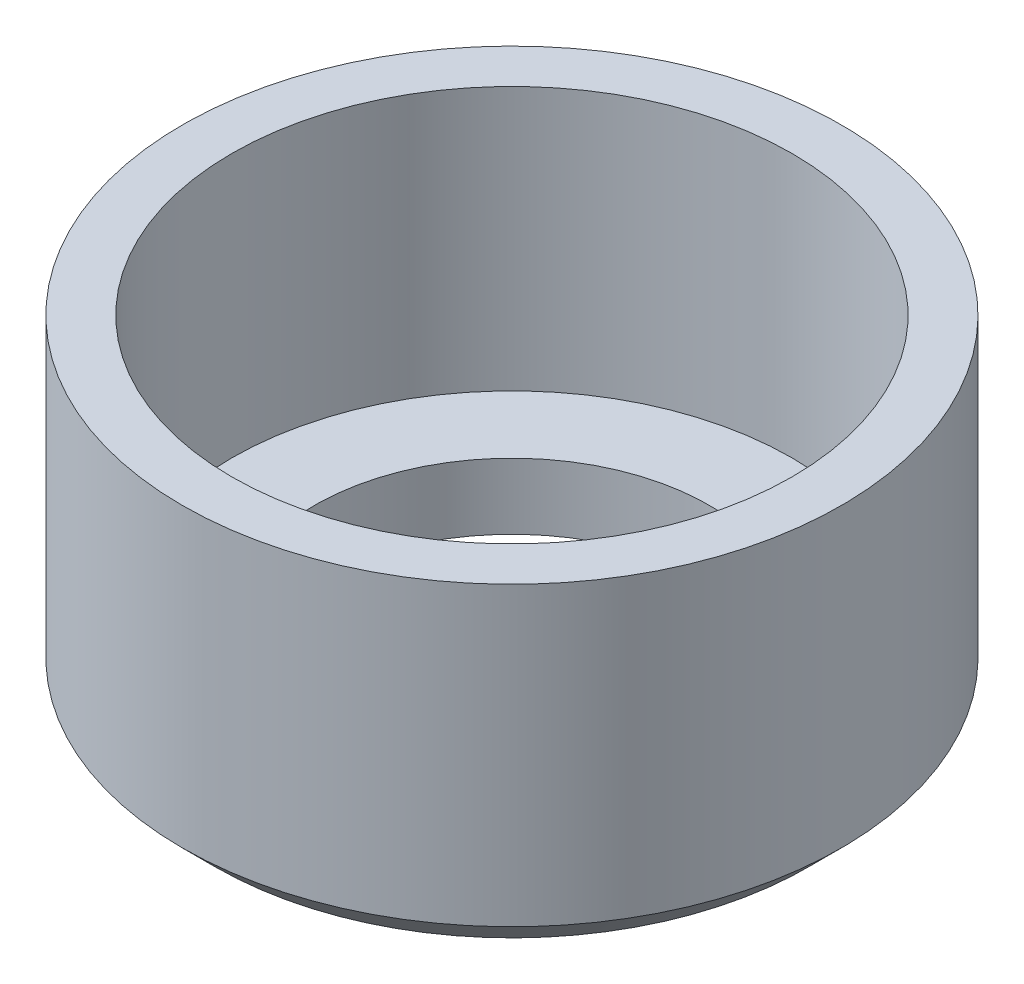
ISO-10303-21;
HEADER;
FILE_DESCRIPTION(('STEP AP214'),'2;1');
FILE_NAME('part.step','',(''),(''),'','','');
FILE_SCHEMA(('AUTOMOTIVE_DESIGN { 1 0 10303 214 1 1 1 1 }'));
ENDSEC;
DATA;
#1=APPLICATION_CONTEXT('core data for automotive mechanical design processes');
#2=APPLICATION_PROTOCOL_DEFINITION('international standard','automotive_design',2000,#1);
#3=PRODUCT_CONTEXT('',#1,'mechanical');
#4=PRODUCT('Part','Part','',(#3));
#5=PRODUCT_RELATED_PRODUCT_CATEGORY('part','',(#4));
#6=PRODUCT_DEFINITION_FORMATION('','',#4);
#7=PRODUCT_DEFINITION_CONTEXT('part definition',#1,'design');
#8=PRODUCT_DEFINITION('design','',#6,#7);
#9=PRODUCT_DEFINITION_SHAPE('','',#8);
#10=(LENGTH_UNIT() NAMED_UNIT(*) SI_UNIT(.MILLI.,.METRE.));
#11=(NAMED_UNIT(*) PLANE_ANGLE_UNIT() SI_UNIT($,.RADIAN.));
#12=(NAMED_UNIT(*) SI_UNIT($,.STERADIAN.) SOLID_ANGLE_UNIT());
#13=UNCERTAINTY_MEASURE_WITH_UNIT(LENGTH_MEASURE(1.E-05),#10,'distance_accuracy_value','');
#14=(GEOMETRIC_REPRESENTATION_CONTEXT(3) GLOBAL_UNCERTAINTY_ASSIGNED_CONTEXT((#13)) GLOBAL_UNIT_ASSIGNED_CONTEXT((#10,
#11,#12)) REPRESENTATION_CONTEXT('',''));
#15=CARTESIAN_POINT('',(0.,0.,0.));
#16=DIRECTION('',(0.,0.,1.));
#17=DIRECTION('',(1.,0.,0.));
#18=AXIS2_PLACEMENT_3D('',#15,#16,#17);
#19=CARTESIAN_POINT('',(0.,10.,0.));
#20=DIRECTION('',(0.,-1.,0.));
#21=DIRECTION('',(0.,0.,-1.));
#22=AXIS2_PLACEMENT_3D('',#19,#20,#21);
#23=CYLINDRICAL_SURFACE('',#22,6.);
#24=CARTESIAN_POINT('',(0.,0.,0.));
#25=DIRECTION('',(0.,1.,0.));
#26=DIRECTION('',(0.,0.,1.));
#27=AXIS2_PLACEMENT_3D('',#24,#25,#26);
#28=CIRCLE('',#27,6.);
#29=CARTESIAN_POINT('',(0.,0.,6.));
#30=VERTEX_POINT('',#29);
#31=EDGE_CURVE('E48',#30,#30,#28,.T.);
#32=ORIENTED_EDGE('',*,*,#31,.F.);
#33=EDGE_LOOP('',(#32));
#34=FACE_BOUND('',#33,.T.);
#35=CARTESIAN_POINT('',(0.,2.,0.));
#36=DIRECTION('',(0.,1.,0.));
#37=DIRECTION('',(0.,0.,1.));
#38=AXIS2_PLACEMENT_3D('',#35,#36,#37);
#39=CIRCLE('',#38,6.);
#40=CARTESIAN_POINT('',(0.,2.,6.));
#41=VERTEX_POINT('',#40);
#42=EDGE_CURVE('E51',#41,#41,#39,.T.);
#43=ORIENTED_EDGE('',*,*,#42,.T.);
#44=EDGE_LOOP('',(#43));
#45=FACE_BOUND('',#44,.T.);
#46=ADVANCED_FACE('F33',(#34,#45),#23,.F.);
#47=CARTESIAN_POINT('',(0.,10.,0.));
#48=DIRECTION('',(0.,1.,0.));
#49=DIRECTION('',(0.,0.,1.));
#50=AXIS2_PLACEMENT_3D('',#47,#48,#49);
#51=PLANE('',#50);
#52=CARTESIAN_POINT('',(0.,10.,0.));
#53=DIRECTION('',(0.,1.,0.));
#54=DIRECTION('',(0.,0.,1.));
#55=AXIS2_PLACEMENT_3D('',#52,#53,#54);
#56=CIRCLE('',#55,8.5);
#57=CARTESIAN_POINT('',(0.,10.,8.5));
#58=VERTEX_POINT('',#57);
#59=EDGE_CURVE('E57',#58,#58,#56,.T.);
#60=ORIENTED_EDGE('',*,*,#59,.F.);
#61=EDGE_LOOP('',(#60));
#62=FACE_BOUND('',#61,.T.);
#63=CARTESIAN_POINT('',(0.,10.,0.));
#64=DIRECTION('',(0.,1.,0.));
#65=DIRECTION('',(0.,0.,1.));
#66=AXIS2_PLACEMENT_3D('',#63,#64,#65);
#67=CIRCLE('',#66,10.);
#68=CARTESIAN_POINT('',(0.,10.,10.));
#69=VERTEX_POINT('',#68);
#70=EDGE_CURVE('E44',#69,#69,#67,.T.);
#71=ORIENTED_EDGE('',*,*,#70,.T.);
#72=EDGE_LOOP('',(#71));
#73=FACE_BOUND('',#72,.T.);
#74=ADVANCED_FACE('F72',(#62,#73),#51,.T.);
#75=CARTESIAN_POINT('',(0.,0.,0.));
#76=DIRECTION('',(0.,1.,0.));
#77=DIRECTION('',(0.,0.,1.));
#78=AXIS2_PLACEMENT_3D('',#75,#76,#77);
#79=PLANE('',#78);
#80=CARTESIAN_POINT('',(0.,0.,0.));
#81=DIRECTION('',(0.,1.,0.));
#82=DIRECTION('',(0.,0.,1.));
#83=AXIS2_PLACEMENT_3D('',#80,#81,#82);
#84=CIRCLE('',#83,9.);
#85=CARTESIAN_POINT('',(0.,0.,9.));
#86=VERTEX_POINT('',#85);
#87=EDGE_CURVE('E10',#86,#86,#84,.F.);
#88=ORIENTED_EDGE('',*,*,#87,.T.);
#89=EDGE_LOOP('',(#88));
#90=FACE_BOUND('',#89,.T.);
#91=ORIENTED_EDGE('',*,*,#31,.T.);
#92=EDGE_LOOP('',(#91));
#93=FACE_BOUND('',#92,.T.);
#94=ADVANCED_FACE('F75',(#90,#93),#79,.F.);
#95=CARTESIAN_POINT('',(0.,10.,0.));
#96=DIRECTION('',(0.,-1.,0.));
#97=DIRECTION('',(0.,0.,-1.));
#98=AXIS2_PLACEMENT_3D('',#95,#96,#97);
#99=CYLINDRICAL_SURFACE('',#98,10.);
#100=CARTESIAN_POINT('',(0.,0.999999999999997,0.));
#101=DIRECTION('',(0.,1.,0.));
#102=DIRECTION('',(0.,0.,1.));
#103=AXIS2_PLACEMENT_3D('',#100,#101,#102);
#104=CIRCLE('',#103,10.);
#105=CARTESIAN_POINT('',(0.,0.999999999999997,10.));
#106=VERTEX_POINT('',#105);
#107=EDGE_CURVE('E40',#106,#106,#104,.T.);
#108=ORIENTED_EDGE('',*,*,#107,.T.);
#109=EDGE_LOOP('',(#108));
#110=FACE_BOUND('',#109,.T.);
#111=ORIENTED_EDGE('',*,*,#70,.F.);
#112=EDGE_LOOP('',(#111));
#113=FACE_BOUND('',#112,.T.);
#114=ADVANCED_FACE('F68',(#110,#113),#99,.T.);
#115=CARTESIAN_POINT('',(0.,2.,0.));
#116=DIRECTION('',(0.,1.,0.));
#117=DIRECTION('',(0.,0.,1.));
#118=AXIS2_PLACEMENT_3D('',#115,#116,#117);
#119=CYLINDRICAL_SURFACE('',#118,8.5);
#120=CARTESIAN_POINT('',(0.,2.,0.));
#121=DIRECTION('',(0.,1.,0.));
#122=DIRECTION('',(0.,0.,1.));
#123=AXIS2_PLACEMENT_3D('',#120,#121,#122);
#124=CIRCLE('',#123,8.5);
#125=CARTESIAN_POINT('',(0.,2.,8.5));
#126=VERTEX_POINT('',#125);
#127=EDGE_CURVE('E53',#126,#126,#124,.T.);
#128=ORIENTED_EDGE('',*,*,#127,.F.);
#129=EDGE_LOOP('',(#128));
#130=FACE_BOUND('',#129,.T.);
#131=ORIENTED_EDGE('',*,*,#59,.T.);
#132=EDGE_LOOP('',(#131));
#133=FACE_BOUND('',#132,.T.);
#134=ADVANCED_FACE('F65',(#130,#133),#119,.F.);
#135=CARTESIAN_POINT('',(0.,2.,0.));
#136=DIRECTION('',(0.,1.,0.));
#137=DIRECTION('',(0.,0.,1.));
#138=AXIS2_PLACEMENT_3D('',#135,#136,#137);
#139=PLANE('',#138);
#140=ORIENTED_EDGE('',*,*,#42,.F.);
#141=EDGE_LOOP('',(#140));
#142=FACE_BOUND('',#141,.T.);
#143=ORIENTED_EDGE('',*,*,#127,.T.);
#144=EDGE_LOOP('',(#143));
#145=FACE_BOUND('',#144,.T.);
#146=ADVANCED_FACE('F63',(#142,#145),#139,.T.);
#147=CARTESIAN_POINT('',(0.,0.999999999999997,0.));
#148=DIRECTION('',(0.,1.,0.));
#149=DIRECTION('',(0.,0.,1.));
#150=AXIS2_PLACEMENT_3D('',#147,#148,#149);
#151=CONICAL_SURFACE('',#150,10.,0.78539816339745);
#152=ORIENTED_EDGE('',*,*,#87,.F.);
#153=EDGE_LOOP('',(#152));
#154=FACE_BOUND('',#153,.T.);
#155=ORIENTED_EDGE('',*,*,#107,.F.);
#156=EDGE_LOOP('',(#155));
#157=FACE_BOUND('',#156,.T.);
#158=ADVANCED_FACE('F35',(#154,#157),#151,.T.);
#159=CLOSED_SHELL('',(#46,#74,#94,#114,#134,#146,#158));
#160=MANIFOLD_SOLID_BREP('B2',#159);
#161=ADVANCED_BREP_SHAPE_REPRESENTATION('',(#18,#160),#14);
#162=SHAPE_DEFINITION_REPRESENTATION(#9,#161);
ENDSEC;
END-ISO-10303-21;
